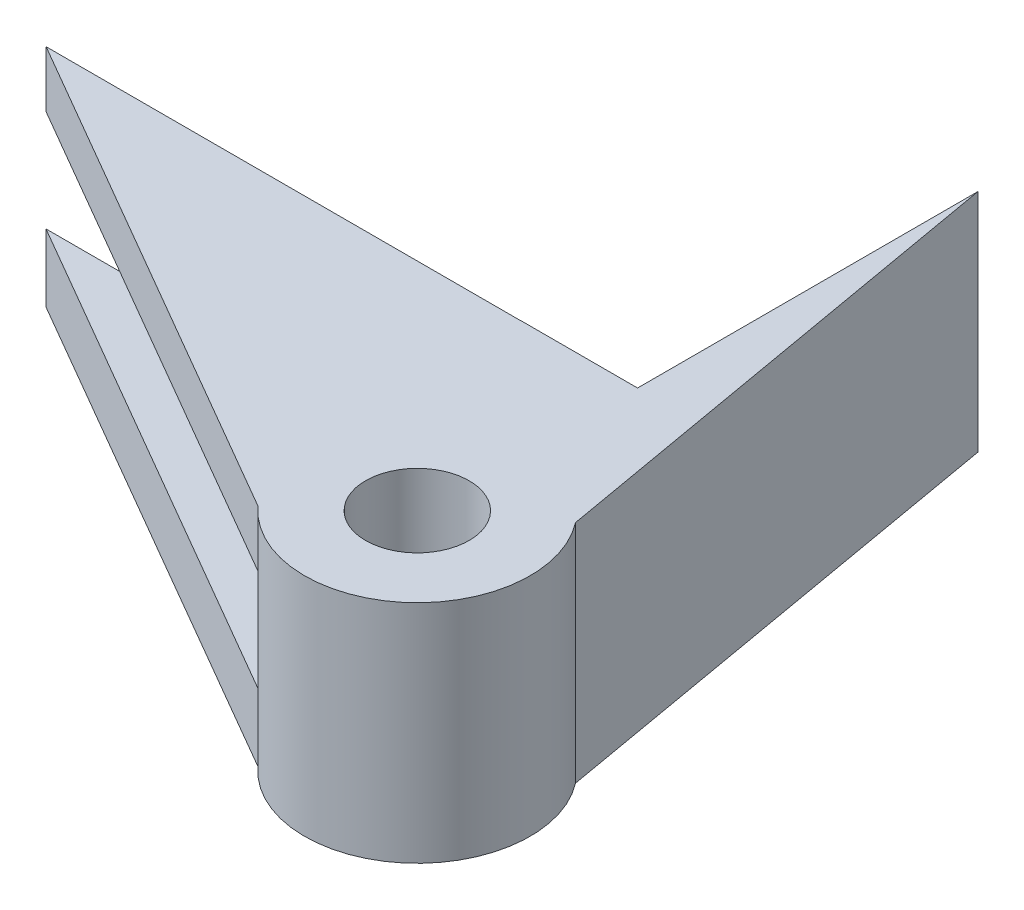
ISO-10303-21;
HEADER;
FILE_DESCRIPTION(('STEP AP214'),'2;1');
FILE_NAME('part.step','',(''),(''),'','','');
FILE_SCHEMA(('AUTOMOTIVE_DESIGN { 1 0 10303 214 1 1 1 1 }'));
ENDSEC;
DATA;
#1=APPLICATION_CONTEXT('core data for automotive mechanical design processes');
#2=APPLICATION_PROTOCOL_DEFINITION('international standard','automotive_design',2000,#1);
#3=PRODUCT_CONTEXT('',#1,'mechanical');
#4=PRODUCT('Part','Part','',(#3));
#5=PRODUCT_RELATED_PRODUCT_CATEGORY('part','',(#4));
#6=PRODUCT_DEFINITION_FORMATION('','',#4);
#7=PRODUCT_DEFINITION_CONTEXT('part definition',#1,'design');
#8=PRODUCT_DEFINITION('design','',#6,#7);
#9=PRODUCT_DEFINITION_SHAPE('','',#8);
#10=(LENGTH_UNIT() NAMED_UNIT(*) SI_UNIT(.MILLI.,.METRE.));
#11=(NAMED_UNIT(*) PLANE_ANGLE_UNIT() SI_UNIT($,.RADIAN.));
#12=(NAMED_UNIT(*) SI_UNIT($,.STERADIAN.) SOLID_ANGLE_UNIT());
#13=UNCERTAINTY_MEASURE_WITH_UNIT(LENGTH_MEASURE(1.E-05),#10,'distance_accuracy_value','');
#14=(GEOMETRIC_REPRESENTATION_CONTEXT(3) GLOBAL_UNCERTAINTY_ASSIGNED_CONTEXT((#13)) GLOBAL_UNIT_ASSIGNED_CONTEXT((#10,
#11,#12)) REPRESENTATION_CONTEXT('',''));
#15=CARTESIAN_POINT('',(0.,0.,0.));
#16=DIRECTION('',(0.,0.,1.));
#17=DIRECTION('',(1.,0.,0.));
#18=AXIS2_PLACEMENT_3D('',#15,#16,#17);
#19=CARTESIAN_POINT('',(0.,6.,0.));
#20=DIRECTION('',(0.,1.,0.));
#21=DIRECTION('',(0.,0.,1.));
#22=AXIS2_PLACEMENT_3D('',#19,#20,#21);
#23=PLANE('',#22);
#24=DIRECTION('',(0.865256932693587,0.,0.501328675048302));
#25=VECTOR('',#24,1.);
#26=CARTESIAN_POINT('',(-5.48521587858774,6.,9.46708477389948));
#27=LINE('',#26,#25);
#28=CARTESIAN_POINT('',(-21.8247175682232,6.,0.));
#29=VERTEX_POINT('',#28);
#30=CARTESIAN_POINT('',(22.8292145969941,6.,25.8724267928088));
#31=VERTEX_POINT('',#30);
#32=EDGE_CURVE('E192',#29,#31,#27,.T.);
#33=ORIENTED_EDGE('',*,*,#32,.T.);
#34=CARTESIAN_POINT('',(30.2494973704641,6.,19.1687409736684));
#35=DIRECTION('',(0.,1.,0.));
#36=DIRECTION('',(0.,0.,1.));
#37=AXIS2_PLACEMENT_3D('',#34,#35,#36);
#38=CIRCLE('',#37,10.);
#39=CARTESIAN_POINT('',(20.2494973704641,6.,19.1687409736684));
#40=VERTEX_POINT('',#39);
#41=EDGE_CURVE('E188',#31,#40,#38,.F.);
#42=ORIENTED_EDGE('',*,*,#41,.T.);
#43=DIRECTION('',(0.,0.,1.));
#44=VECTOR('',#43,1.);
#45=CARTESIAN_POINT('',(20.2494973704639,6.,-2.34563743635096E-13));
#46=LINE('',#45,#44);
#47=CARTESIAN_POINT('',(20.249497370464,6.,0.));
#48=VERTEX_POINT('',#47);
#49=EDGE_CURVE('E69',#48,#40,#46,.T.);
#50=ORIENTED_EDGE('',*,*,#49,.F.);
#51=DIRECTION('',(-1.,0.,0.));
#52=VECTOR('',#51,1.);
#53=CARTESIAN_POINT('',(0.,6.,0.));
#54=LINE('',#53,#52);
#55=EDGE_CURVE('E195',#48,#29,#54,.T.);
#56=ORIENTED_EDGE('',*,*,#55,.T.);
#57=EDGE_LOOP('',(#33,#42,#50,#56));
#58=FACE_BOUND('',#57,.T.);
#59=ADVANCED_FACE('F45',(#58),#23,.T.);
#60=CARTESIAN_POINT('',(-5.48521587858774,6.,9.46708477389948));
#61=DIRECTION('',(0.501328675048302,0.,-0.865256932693587));
#62=DIRECTION('',(-0.865256932693587,0.,-0.501328675048302));
#63=AXIS2_PLACEMENT_3D('',#60,#61,#62);
#64=PLANE('',#63);
#65=DIRECTION('',(0.865256932693587,0.,0.501328675048302));
#66=VECTOR('',#65,1.);
#67=CARTESIAN_POINT('',(-5.48521587858774,0.,9.46708477389948));
#68=LINE('',#67,#66);
#69=CARTESIAN_POINT('',(-21.8247175682232,0.,0.));
#70=VERTEX_POINT('',#69);
#71=CARTESIAN_POINT('',(22.8292145969941,0.,25.8724267928088));
#72=VERTEX_POINT('',#71);
#73=EDGE_CURVE('E191',#70,#72,#68,.T.);
#74=ORIENTED_EDGE('',*,*,#73,.T.);
#75=DIRECTION('',(0.,-1.,0.));
#76=VECTOR('',#75,1.);
#77=CARTESIAN_POINT('',(22.8292145969941,6.,25.8724267928088));
#78=LINE('',#77,#76);
#79=EDGE_CURVE('E54',#31,#72,#78,.T.);
#80=ORIENTED_EDGE('',*,*,#79,.F.);
#81=ORIENTED_EDGE('',*,*,#32,.F.);
#82=DIRECTION('',(0.,-1.,0.));
#83=VECTOR('',#82,1.);
#84=CARTESIAN_POINT('',(-21.8247175682232,6.,0.));
#85=LINE('',#84,#83);
#86=EDGE_CURVE('E199',#29,#70,#85,.T.);
#87=ORIENTED_EDGE('',*,*,#86,.T.);
#88=EDGE_LOOP('',(#74,#80,#81,#87));
#89=FACE_BOUND('',#88,.T.);
#90=ADVANCED_FACE('F47',(#89),#64,.F.);
#91=CARTESIAN_POINT('',(30.2494973704641,6.,19.1687409736684));
#92=DIRECTION('',(0.,-1.,0.));
#93=DIRECTION('',(0.,0.,-1.));
#94=AXIS2_PLACEMENT_3D('',#91,#92,#93);
#95=CYLINDRICAL_SURFACE('',#94,10.);
#96=CARTESIAN_POINT('',(30.2494973704641,20.,19.1687409736684));
#97=DIRECTION('',(0.,1.,0.));
#98=DIRECTION('',(0.,0.,1.));
#99=AXIS2_PLACEMENT_3D('',#96,#97,#98);
#100=CIRCLE('',#99,10.);
#101=CARTESIAN_POINT('',(22.829214596994,20.,25.8724267928088));
#102=VERTEX_POINT('',#101);
#103=CARTESIAN_POINT('',(38.1766295825365,20.,13.0727935581862));
#104=VERTEX_POINT('',#103);
#105=EDGE_CURVE('E162',#102,#104,#100,.T.);
#106=ORIENTED_EDGE('',*,*,#105,.F.);
#107=DIRECTION('',(0.,1.,0.));
#108=VECTOR('',#107,1.);
#109=CARTESIAN_POINT('',(22.829214596994,15.,25.8724267928088));
#110=LINE('',#109,#108);
#111=CARTESIAN_POINT('',(22.829214596994,15.,25.8724267928088));
#112=VERTEX_POINT('',#111);
#113=EDGE_CURVE('E141',#112,#102,#110,.T.);
#114=ORIENTED_EDGE('',*,*,#113,.F.);
#115=CARTESIAN_POINT('',(30.2494973704641,15.,19.1687409736684));
#116=DIRECTION('',(0.,1.,0.));
#117=DIRECTION('',(0.,0.,1.));
#118=AXIS2_PLACEMENT_3D('',#115,#116,#117);
#119=CIRCLE('',#118,10.);
#120=CARTESIAN_POINT('',(20.2494973704641,15.,19.1687409736686));
#121=VERTEX_POINT('',#120);
#122=EDGE_CURVE('E134',#121,#112,#119,.T.);
#123=ORIENTED_EDGE('',*,*,#122,.F.);
#124=DIRECTION('',(0.,-1.,0.));
#125=VECTOR('',#124,1.);
#126=CARTESIAN_POINT('',(20.2494973704641,20.,19.1687409736684));
#127=LINE('',#126,#125);
#128=EDGE_CURVE('E179',#121,#40,#127,.T.);
#129=ORIENTED_EDGE('',*,*,#128,.T.);
#130=ORIENTED_EDGE('',*,*,#41,.F.);
#131=ORIENTED_EDGE('',*,*,#79,.T.);
#132=CARTESIAN_POINT('',(30.2494973704641,0.,19.1687409736684));
#133=DIRECTION('',(0.,1.,0.));
#134=DIRECTION('',(0.,0.,1.));
#135=AXIS2_PLACEMENT_3D('',#132,#133,#134);
#136=CIRCLE('',#135,10.);
#137=CARTESIAN_POINT('',(38.1766295825365,0.,13.0727935581862));
#138=VERTEX_POINT('',#137);
#139=EDGE_CURVE('E203',#72,#138,#136,.T.);
#140=ORIENTED_EDGE('',*,*,#139,.T.);
#141=DIRECTION('',(0.,-1.,0.));
#142=VECTOR('',#141,1.);
#143=CARTESIAN_POINT('',(38.1766295825365,6.,13.0727935581862));
#144=LINE('',#143,#142);
#145=EDGE_CURVE('E230',#104,#138,#144,.T.);
#146=ORIENTED_EDGE('',*,*,#145,.F.);
#147=EDGE_LOOP('',(#106,#114,#123,#129,#130,#131,#140,#146));
#148=FACE_BOUND('',#147,.T.);
#149=ADVANCED_FACE('F238',(#148),#95,.T.);
#150=CARTESIAN_POINT('',(34.8163101791871,6.,-6.1015779598393));
#151=DIRECTION('',(0.984988531155062,0.,-0.172619794615196));
#152=DIRECTION('',(-0.172619794615196,0.,-0.984988531155063));
#153=AXIS2_PLACEMENT_3D('',#150,#151,#152);
#154=PLANE('',#153);
#155=DIRECTION('',(0.172619794615196,0.,0.984988531155063));
#156=VECTOR('',#155,1.);
#157=CARTESIAN_POINT('',(34.8163101791871,0.,-6.1015779598393));
#158=LINE('',#157,#156);
#159=CARTESIAN_POINT('',(30.59878614381,0.,-30.1672583412685));
#160=VERTEX_POINT('',#159);
#161=EDGE_CURVE('E207',#160,#138,#158,.T.);
#162=ORIENTED_EDGE('',*,*,#161,.F.);
#163=DIRECTION('',(0.,-1.,0.));
#164=VECTOR('',#163,1.);
#165=CARTESIAN_POINT('',(30.59878614381,6.,-30.1672583412685));
#166=LINE('',#165,#164);
#167=CARTESIAN_POINT('',(30.59878614381,20.,-30.1672583412685));
#168=VERTEX_POINT('',#167);
#169=EDGE_CURVE('E227',#168,#160,#166,.T.);
#170=ORIENTED_EDGE('',*,*,#169,.F.);
#171=DIRECTION('',(0.172619794615196,0.,0.984988531155063));
#172=VECTOR('',#171,1.);
#173=CARTESIAN_POINT('',(34.8163101791871,20.,-6.1015779598393));
#174=LINE('',#173,#172);
#175=EDGE_CURVE('E165',#168,#104,#174,.T.);
#176=ORIENTED_EDGE('',*,*,#175,.T.);
#177=ORIENTED_EDGE('',*,*,#145,.T.);
#178=EDGE_LOOP('',(#162,#170,#176,#177));
#179=FACE_BOUND('',#178,.T.);
#180=ADVANCED_FACE('F251',(#179),#154,.T.);
#181=CARTESIAN_POINT('',(30.59878614381,6.,0.));
#182=DIRECTION('',(1.,0.,0.));
#183=DIRECTION('',(0.,0.,-1.));
#184=AXIS2_PLACEMENT_3D('',#181,#182,#183);
#185=PLANE('',#184);
#186=DIRECTION('',(0.,-1.,0.));
#187=VECTOR('',#186,1.);
#188=CARTESIAN_POINT('',(30.59878614381,6.,0.));
#189=LINE('',#188,#187);
#190=CARTESIAN_POINT('',(30.59878614381,20.,0.));
#191=VERTEX_POINT('',#190);
#192=CARTESIAN_POINT('',(30.59878614381,0.,0.));
#193=VERTEX_POINT('',#192);
#194=EDGE_CURVE('E224',#191,#193,#189,.T.);
#195=ORIENTED_EDGE('',*,*,#194,.F.);
#196=DIRECTION('',(0.,0.,1.));
#197=VECTOR('',#196,1.);
#198=CARTESIAN_POINT('',(30.59878614381,20.,0.));
#199=LINE('',#198,#197);
#200=EDGE_CURVE('E169',#168,#191,#199,.T.);
#201=ORIENTED_EDGE('',*,*,#200,.F.);
#202=ORIENTED_EDGE('',*,*,#169,.T.);
#203=DIRECTION('',(0.,0.,1.));
#204=VECTOR('',#203,1.);
#205=CARTESIAN_POINT('',(30.59878614381,0.,0.));
#206=LINE('',#205,#204);
#207=EDGE_CURVE('E211',#160,#193,#206,.T.);
#208=ORIENTED_EDGE('',*,*,#207,.T.);
#209=EDGE_LOOP('',(#195,#201,#202,#208));
#210=FACE_BOUND('',#209,.T.);
#211=ADVANCED_FACE('F260',(#210),#185,.F.);
#212=CARTESIAN_POINT('',(0.,6.,0.));
#213=DIRECTION('',(0.,0.,1.));
#214=DIRECTION('',(1.,0.,0.));
#215=AXIS2_PLACEMENT_3D('',#212,#213,#214);
#216=PLANE('',#215);
#217=DIRECTION('',(0.,-1.,0.));
#218=VECTOR('',#217,1.);
#219=CARTESIAN_POINT('',(20.249497370464,20.,0.));
#220=LINE('',#219,#218);
#221=CARTESIAN_POINT('',(20.249497370464,20.,0.));
#222=VERTEX_POINT('',#221);
#223=EDGE_CURVE('E182',#222,#48,#220,.T.);
#224=ORIENTED_EDGE('',*,*,#223,.F.);
#225=DIRECTION('',(-1.,0.,0.));
#226=VECTOR('',#225,1.);
#227=CARTESIAN_POINT('',(0.,20.,0.));
#228=LINE('',#227,#226);
#229=EDGE_CURVE('E172',#191,#222,#228,.T.);
#230=ORIENTED_EDGE('',*,*,#229,.F.);
#231=ORIENTED_EDGE('',*,*,#194,.T.);
#232=DIRECTION('',(-1.,0.,0.));
#233=VECTOR('',#232,1.);
#234=CARTESIAN_POINT('',(0.,0.,0.));
#235=LINE('',#234,#233);
#236=EDGE_CURVE('E215',#193,#70,#235,.T.);
#237=ORIENTED_EDGE('',*,*,#236,.T.);
#238=ORIENTED_EDGE('',*,*,#86,.F.);
#239=ORIENTED_EDGE('',*,*,#55,.F.);
#240=EDGE_LOOP('',(#224,#230,#231,#237,#238,#239));
#241=FACE_BOUND('',#240,.T.);
#242=ADVANCED_FACE('F263',(#241),#216,.F.);
#243=CARTESIAN_POINT('',(30.2494973704641,6.,19.1687409736684));
#244=DIRECTION('',(0.,-1.,0.));
#245=DIRECTION('',(0.,0.,-1.));
#246=AXIS2_PLACEMENT_3D('',#243,#244,#245);
#247=CYLINDRICAL_SURFACE('',#246,4.59007839635621);
#248=CARTESIAN_POINT('',(30.2494973704641,0.,19.1687409736684));
#249=DIRECTION('',(0.,1.,0.));
#250=DIRECTION('',(0.,0.,1.));
#251=AXIS2_PLACEMENT_3D('',#248,#249,#250);
#252=CIRCLE('',#251,4.59007839635621);
#253=CARTESIAN_POINT('',(30.2494973704641,0.,23.7588193700246));
#254=VERTEX_POINT('',#253);
#255=EDGE_CURVE('E196',#254,#254,#252,.T.);
#256=ORIENTED_EDGE('',*,*,#255,.F.);
#257=EDGE_LOOP('',(#256));
#258=FACE_BOUND('',#257,.T.);
#259=CARTESIAN_POINT('',(30.2494973704641,20.,19.1687409736684));
#260=DIRECTION('',(0.,1.,0.));
#261=DIRECTION('',(0.,0.,1.));
#262=AXIS2_PLACEMENT_3D('',#259,#260,#261);
#263=CIRCLE('',#262,4.59007839635621);
#264=CARTESIAN_POINT('',(30.2494973704641,20.,23.7588193700246));
#265=VERTEX_POINT('',#264);
#266=EDGE_CURVE('E158',#265,#265,#263,.T.);
#267=ORIENTED_EDGE('',*,*,#266,.T.);
#268=EDGE_LOOP('',(#267));
#269=FACE_BOUND('',#268,.T.);
#270=ADVANCED_FACE('F278',(#258,#269),#247,.F.);
#271=CARTESIAN_POINT('',(0.,0.,0.));
#272=DIRECTION('',(0.,1.,0.));
#273=DIRECTION('',(0.,0.,1.));
#274=AXIS2_PLACEMENT_3D('',#271,#272,#273);
#275=PLANE('',#274);
#276=ORIENTED_EDGE('',*,*,#139,.F.);
#277=ORIENTED_EDGE('',*,*,#73,.F.);
#278=ORIENTED_EDGE('',*,*,#236,.F.);
#279=ORIENTED_EDGE('',*,*,#207,.F.);
#280=ORIENTED_EDGE('',*,*,#161,.T.);
#281=EDGE_LOOP('',(#276,#277,#278,#279,#280));
#282=FACE_BOUND('',#281,.T.);
#283=ORIENTED_EDGE('',*,*,#255,.T.);
#284=EDGE_LOOP('',(#283));
#285=FACE_BOUND('',#284,.T.);
#286=ADVANCED_FACE('F246',(#282,#285),#275,.F.);
#287=CARTESIAN_POINT('',(20.2494973704639,20.,-2.34563743635096E-13));
#288=DIRECTION('',(-1.,0.,0.));
#289=DIRECTION('',(0.,0.,1.));
#290=AXIS2_PLACEMENT_3D('',#287,#288,#289);
#291=PLANE('',#290);
#292=DIRECTION('',(0.,-1.,0.));
#293=VECTOR('',#292,1.);
#294=CARTESIAN_POINT('',(20.2494973704639,20.,0.0126105880931679));
#295=LINE('',#294,#293);
#296=CARTESIAN_POINT('',(20.249497370464,20.,0.0126105880931679));
#297=VERTEX_POINT('',#296);
#298=CARTESIAN_POINT('',(20.249497370464,15.,0.0126105880931679));
#299=VERTEX_POINT('',#298);
#300=EDGE_CURVE('E129',#297,#299,#295,.T.);
#301=ORIENTED_EDGE('',*,*,#300,.F.);
#302=DIRECTION('',(0.,0.,-1.));
#303=VECTOR('',#302,1.);
#304=CARTESIAN_POINT('',(20.2494973704639,20.,-2.34563743635096E-13));
#305=LINE('',#304,#303);
#306=EDGE_CURVE('E175',#297,#222,#305,.T.);
#307=ORIENTED_EDGE('',*,*,#306,.T.);
#308=ORIENTED_EDGE('',*,*,#223,.T.);
#309=ORIENTED_EDGE('',*,*,#49,.T.);
#310=ORIENTED_EDGE('',*,*,#128,.F.);
#311=DIRECTION('',(0.,0.,-1.));
#312=VECTOR('',#311,1.);
#313=CARTESIAN_POINT('',(20.2494973704639,15.,-2.34563743635096E-13));
#314=LINE('',#313,#312);
#315=EDGE_CURVE('E11',#121,#299,#314,.T.);
#316=ORIENTED_EDGE('',*,*,#315,.T.);
#317=EDGE_LOOP('',(#301,#307,#308,#309,#310,#316));
#318=FACE_BOUND('',#317,.T.);
#319=ADVANCED_FACE('F265',(#318),#291,.T.);
#320=CARTESIAN_POINT('',(0.,20.,0.));
#321=DIRECTION('',(0.,1.,0.));
#322=DIRECTION('',(0.,0.,1.));
#323=AXIS2_PLACEMENT_3D('',#320,#321,#322);
#324=PLANE('',#323);
#325=ORIENTED_EDGE('',*,*,#306,.F.);
#326=DIRECTION('',(-1.,0.,0.));
#327=VECTOR('',#326,1.);
#328=CARTESIAN_POINT('',(0.,20.,0.0126105880931704));
#329=LINE('',#328,#327);
#330=CARTESIAN_POINT('',(-21.8029526077969,20.,0.0126105880931731));
#331=VERTEX_POINT('',#330);
#332=EDGE_CURVE('E149',#297,#331,#329,.T.);
#333=ORIENTED_EDGE('',*,*,#332,.T.);
#334=DIRECTION('',(0.865256932693587,0.,0.501328675048302));
#335=VECTOR('',#334,1.);
#336=CARTESIAN_POINT('',(-5.48521587858774,20.,9.46708477389948));
#337=LINE('',#336,#335);
#338=EDGE_CURVE('E61',#331,#102,#337,.T.);
#339=ORIENTED_EDGE('',*,*,#338,.T.);
#340=ORIENTED_EDGE('',*,*,#105,.T.);
#341=ORIENTED_EDGE('',*,*,#175,.F.);
#342=ORIENTED_EDGE('',*,*,#200,.T.);
#343=ORIENTED_EDGE('',*,*,#229,.T.);
#344=EDGE_LOOP('',(#325,#333,#339,#340,#341,#342,#343));
#345=FACE_BOUND('',#344,.T.);
#346=ORIENTED_EDGE('',*,*,#266,.F.);
#347=EDGE_LOOP('',(#346));
#348=FACE_BOUND('',#347,.T.);
#349=ADVANCED_FACE('F255',(#345,#348),#324,.T.);
#350=CARTESIAN_POINT('',(-5.48521587858774,15.,9.46708477389948));
#351=DIRECTION('',(-0.501328675048302,0.,0.865256932693587));
#352=DIRECTION('',(0.865256932693587,0.,0.501328675048302));
#353=AXIS2_PLACEMENT_3D('',#350,#351,#352);
#354=PLANE('',#353);
#355=ORIENTED_EDGE('',*,*,#338,.F.);
#356=DIRECTION('',(0.,1.,0.));
#357=VECTOR('',#356,1.);
#358=CARTESIAN_POINT('',(-21.8029526077969,15.,0.0126105880931731));
#359=LINE('',#358,#357);
#360=CARTESIAN_POINT('',(-21.8029526077969,15.,0.0126105880931731));
#361=VERTEX_POINT('',#360);
#362=EDGE_CURVE('E127',#361,#331,#359,.T.);
#363=ORIENTED_EDGE('',*,*,#362,.F.);
#364=DIRECTION('',(0.865256932693587,0.,0.501328675048302));
#365=VECTOR('',#364,1.);
#366=CARTESIAN_POINT('',(-5.48521587858774,15.,9.46708477389948));
#367=LINE('',#366,#365);
#368=EDGE_CURVE('E133',#361,#112,#367,.T.);
#369=ORIENTED_EDGE('',*,*,#368,.T.);
#370=ORIENTED_EDGE('',*,*,#113,.T.);
#371=EDGE_LOOP('',(#355,#363,#369,#370));
#372=FACE_BOUND('',#371,.T.);
#373=ADVANCED_FACE('F138',(#372),#354,.T.);
#374=CARTESIAN_POINT('',(0.,15.,0.0126105880931704));
#375=DIRECTION('',(0.,0.,-1.));
#376=DIRECTION('',(-1.,0.,0.));
#377=AXIS2_PLACEMENT_3D('',#374,#375,#376);
#378=PLANE('',#377);
#379=ORIENTED_EDGE('',*,*,#332,.F.);
#380=ORIENTED_EDGE('',*,*,#300,.T.);
#381=DIRECTION('',(-1.,0.,0.));
#382=VECTOR('',#381,1.);
#383=CARTESIAN_POINT('',(0.,15.,0.0126105880931704));
#384=LINE('',#383,#382);
#385=EDGE_CURVE('E124',#299,#361,#384,.T.);
#386=ORIENTED_EDGE('',*,*,#385,.T.);
#387=ORIENTED_EDGE('',*,*,#362,.T.);
#388=EDGE_LOOP('',(#379,#380,#386,#387));
#389=FACE_BOUND('',#388,.T.);
#390=ADVANCED_FACE('F126',(#389),#378,.T.);
#391=CARTESIAN_POINT('',(0.,15.,0.));
#392=DIRECTION('',(0.,1.,0.));
#393=DIRECTION('',(0.,0.,1.));
#394=AXIS2_PLACEMENT_3D('',#391,#392,#393);
#395=PLANE('',#394);
#396=ORIENTED_EDGE('',*,*,#315,.F.);
#397=ORIENTED_EDGE('',*,*,#122,.T.);
#398=ORIENTED_EDGE('',*,*,#368,.F.);
#399=ORIENTED_EDGE('',*,*,#385,.F.);
#400=EDGE_LOOP('',(#396,#397,#398,#399));
#401=FACE_BOUND('',#400,.T.);
#402=ADVANCED_FACE('F143',(#401),#395,.F.);
#403=CLOSED_SHELL('',(#59,#90,#149,#180,#211,#242,#270,#286,#319,#349,#373,#390,#402));
#404=MANIFOLD_SOLID_BREP('B2',#403);
#405=ADVANCED_BREP_SHAPE_REPRESENTATION('',(#18,#404),#14);
#406=SHAPE_DEFINITION_REPRESENTATION(#9,#405);
ENDSEC;
END-ISO-10303-21;
